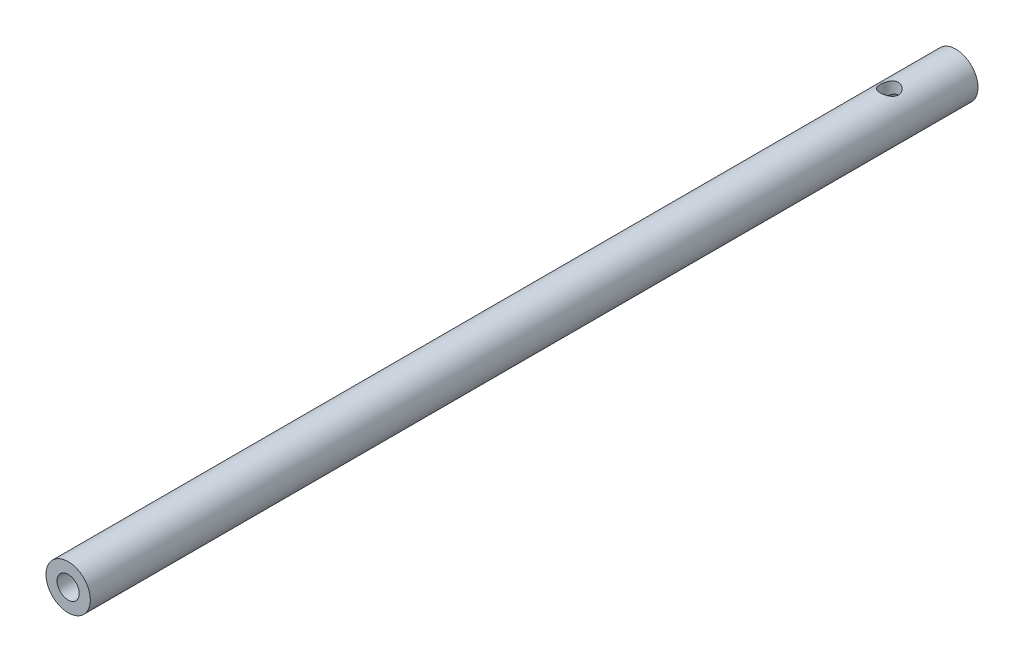
ISO-10303-21;
HEADER;
FILE_DESCRIPTION(('STEP AP214'),'2;1');
FILE_NAME('part.step','',(''),(''),'','','');
FILE_SCHEMA(('AUTOMOTIVE_DESIGN { 1 0 10303 214 1 1 1 1 }'));
ENDSEC;
DATA;
#1=APPLICATION_CONTEXT('core data for automotive mechanical design processes');
#2=APPLICATION_PROTOCOL_DEFINITION('international standard','automotive_design',2000,#1);
#3=PRODUCT_CONTEXT('',#1,'mechanical');
#4=PRODUCT('Part','Part','',(#3));
#5=PRODUCT_RELATED_PRODUCT_CATEGORY('part','',(#4));
#6=PRODUCT_DEFINITION_FORMATION('','',#4);
#7=PRODUCT_DEFINITION_CONTEXT('part definition',#1,'design');
#8=PRODUCT_DEFINITION('design','',#6,#7);
#9=PRODUCT_DEFINITION_SHAPE('','',#8);
#10=(LENGTH_UNIT() NAMED_UNIT(*) SI_UNIT(.MILLI.,.METRE.));
#11=(NAMED_UNIT(*) PLANE_ANGLE_UNIT() SI_UNIT($,.RADIAN.));
#12=(NAMED_UNIT(*) SI_UNIT($,.STERADIAN.) SOLID_ANGLE_UNIT());
#13=UNCERTAINTY_MEASURE_WITH_UNIT(LENGTH_MEASURE(1.E-05),#10,'distance_accuracy_value','');
#14=(GEOMETRIC_REPRESENTATION_CONTEXT(3) GLOBAL_UNCERTAINTY_ASSIGNED_CONTEXT((#13)) GLOBAL_UNIT_ASSIGNED_CONTEXT((#10,
#11,#12)) REPRESENTATION_CONTEXT('',''));
#15=CARTESIAN_POINT('',(0.,0.,0.));
#16=DIRECTION('',(0.,0.,1.));
#17=DIRECTION('',(1.,0.,0.));
#18=AXIS2_PLACEMENT_3D('',#15,#16,#17);
#19=CARTESIAN_POINT('',(0.,0.,254.));
#20=DIRECTION('',(0.,0.,-1.));
#21=DIRECTION('',(-1.,0.,0.));
#22=AXIS2_PLACEMENT_3D('',#19,#20,#21);
#23=CYLINDRICAL_SURFACE('',#22,6.35);
#24=CARTESIAN_POINT('',(0.,0.,254.));
#25=DIRECTION('',(0.,0.,1.));
#26=DIRECTION('',(1.,0.,0.));
#27=AXIS2_PLACEMENT_3D('',#24,#25,#26);
#28=CIRCLE('',#27,6.35);
#29=CARTESIAN_POINT('',(6.35,0.,254.));
#30=VERTEX_POINT('',#29);
#31=EDGE_CURVE('E10',#30,#30,#28,.T.);
#32=ORIENTED_EDGE('',*,*,#31,.F.);
#33=EDGE_LOOP('',(#32));
#34=FACE_BOUND('',#33,.T.);
#35=CARTESIAN_POINT('',(0.,0.,0.));
#36=DIRECTION('',(0.,0.,1.));
#37=DIRECTION('',(1.,0.,0.));
#38=AXIS2_PLACEMENT_3D('',#35,#36,#37);
#39=CIRCLE('',#38,6.35);
#40=CARTESIAN_POINT('',(6.35,0.,0.));
#41=VERTEX_POINT('',#40);
#42=EDGE_CURVE('E49',#41,#41,#39,.T.);
#43=ORIENTED_EDGE('',*,*,#42,.T.);
#44=EDGE_LOOP('',(#43));
#45=FACE_BOUND('',#44,.T.);
#46=CARTESIAN_POINT('',(0.,-6.35,16.4465));
#47=CARTESIAN_POINT('',(0.139658814291288,-6.34999230960377,16.4465102226711));
#48=CARTESIAN_POINT('',(0.279530257247805,-6.34534036381928,16.4578017537463));
#49=CARTESIAN_POINT('',(0.555326205995201,-6.32718958016325,16.5025616753636));
#50=CARTESIAN_POINT('',(0.691239232516735,-6.31366725988581,16.5360889328069));
#51=CARTESIAN_POINT('',(0.954668600487469,-6.27922707037871,16.6238871124743));
#52=CARTESIAN_POINT('',(1.08221135527028,-6.25833393780924,16.6780886998569));
#53=CARTESIAN_POINT('',(1.32627409088728,-6.21119684091545,16.8054140515908));
#54=CARTESIAN_POINT('',(1.44279759021604,-6.18495459308891,16.8785317479016));
#55=CARTESIAN_POINT('',(1.66739734947652,-6.12831928174332,17.0453966831688));
#56=CARTESIAN_POINT('',(1.77486323558414,-6.09779311517474,17.1399199354052));
#57=CARTESIAN_POINT('',(1.97293884172907,-6.0366199159849,17.3452732090919));
#58=CARTESIAN_POINT('',(2.06353994471538,-6.00597282970173,17.4561115151993));
#59=CARTESIAN_POINT('',(2.22954167018138,-5.94641053890916,17.69730674714));
#60=CARTESIAN_POINT('',(2.30402094366906,-5.91764575362854,17.8283387990433));
#61=CARTESIAN_POINT('',(2.42960950289775,-5.86720650548979,18.1024235877533));
#62=CARTESIAN_POINT('',(2.48073044904994,-5.84552850646919,18.24547028457));
#63=CARTESIAN_POINT('',(2.55565156257861,-5.81315316290526,18.5325021377006));
#64=CARTESIAN_POINT('',(2.58062408509252,-5.80198713580705,18.676126426089));
#65=CARTESIAN_POINT('',(2.60619906398776,-5.79054777240608,18.9659274568753));
#66=CARTESIAN_POINT('',(2.60681435812765,-5.79026869801029,19.112102814056));
#67=CARTESIAN_POINT('',(2.58454261015411,-5.80023683264105,19.3913489386495));
#68=CARTESIAN_POINT('',(2.56338615410154,-5.80970896160431,19.5245908830448));
#69=CARTESIAN_POINT('',(2.5010673028753,-5.83680602043765,19.7854339864594));
#70=CARTESIAN_POINT('',(2.45990121708404,-5.85443245427567,19.9130341001494));
#71=CARTESIAN_POINT('',(2.35793588852338,-5.89624608381517,20.1621374857699));
#72=CARTESIAN_POINT('',(2.29674349739842,-5.92056295920541,20.2834570877194));
#73=CARTESIAN_POINT('',(2.15673971446528,-5.97298517723353,20.5145674290705));
#74=CARTESIAN_POINT('',(2.07792150298237,-6.001091984573,20.6243536818286));
#75=CARTESIAN_POINT('',(1.89735106245734,-6.06071802706638,20.8387069358899));
#76=CARTESIAN_POINT('',(1.79425242543104,-6.09232858785375,20.9421174690434));
#77=CARTESIAN_POINT('',(1.57185331692354,-6.15345975457155,21.1305618702178));
#78=CARTESIAN_POINT('',(1.45254929499361,-6.18297990034933,21.2155917005894));
#79=CARTESIAN_POINT('',(1.19770658302539,-6.23741262563076,21.3664839632734));
#80=CARTESIAN_POINT('',(1.06187172814138,-6.2622112927114,21.4318903166335));
#81=CARTESIAN_POINT('',(0.779851265954162,-6.30353804709347,21.5385209026196));
#82=CARTESIAN_POINT('',(0.633671239074538,-6.32007055511376,21.5797580628994));
#83=CARTESIAN_POINT('',(0.344786356341334,-6.34218454804494,21.6344922632422));
#84=CARTESIAN_POINT('',(0.202422473732529,-6.34837809999038,21.6495421709774));
#85=CARTESIAN_POINT('',(-0.0829187905619075,-6.35105963877295,21.6560863095486));
#86=CARTESIAN_POINT('',(-0.225895992291909,-6.34755030086248,21.6475870332953));
#87=CARTESIAN_POINT('',(-0.50122811648109,-6.33161894915713,21.6083982329454));
#88=CARTESIAN_POINT('',(-0.633764366126784,-6.31963018013048,21.5787868338127));
#89=CARTESIAN_POINT('',(-0.891852024786359,-6.28840276052691,21.4997012529322));
#90=CARTESIAN_POINT('',(-1.01740254253342,-6.26916318728721,21.4502245432767));
#91=CARTESIAN_POINT('',(-1.26232894087162,-6.22454880909407,21.3311952083711));
#92=CARTESIAN_POINT('',(-1.38139405487112,-6.19900276246011,21.2610693641021));
#93=CARTESIAN_POINT('',(-1.60649026009733,-6.1445197225746,21.1033645178561));
#94=CARTESIAN_POINT('',(-1.71251596155739,-6.11558133670772,21.0157783376928));
#95=CARTESIAN_POINT('',(-1.91623851491026,-6.05496475787895,20.8185327714779));
#96=CARTESIAN_POINT('',(-2.01284942796907,-6.02323564843281,20.7077645329559));
#97=CARTESIAN_POINT('',(-2.18640018463071,-5.96243507573864,20.4710585688108));
#98=CARTESIAN_POINT('',(-2.26333607582038,-5.93336414723113,20.3451178027206));
#99=CARTESIAN_POINT('',(-2.39603879254114,-5.88104346392423,20.0793343439105));
#100=CARTESIAN_POINT('',(-2.45153279874427,-5.85786993450669,19.9393393363992));
#101=CARTESIAN_POINT('',(-2.53770460075326,-5.82106452476415,19.6507476518406));
#102=CARTESIAN_POINT('',(-2.56840198459768,-5.80742511413165,19.5021578638576));
#103=CARTESIAN_POINT('',(-2.60219242273593,-5.79235748837676,19.2126021576906));
#104=CARTESIAN_POINT('',(-2.60718297249355,-5.79009022443092,19.0719001670726));
#105=CARTESIAN_POINT('',(-2.59445040708602,-5.79580681396036,18.7917543511859));
#106=CARTESIAN_POINT('',(-2.57673052204656,-5.80378920961758,18.6523103498327));
#107=CARTESIAN_POINT('',(-2.52065654106205,-5.82834944297404,18.3848964057967));
#108=CARTESIAN_POINT('',(-2.48323688739072,-5.84453688190049,18.2566913061476));
#109=CARTESIAN_POINT('',(-2.38972322864851,-5.88338960597767,18.0083403796797));
#110=CARTESIAN_POINT('',(-2.33362401134901,-5.90605669892048,17.888196813556));
#111=CARTESIAN_POINT('',(-2.20052479575199,-5.9569745038205,17.6516460948968));
#112=CARTESIAN_POINT('',(-2.1224866851117,-5.98547579558712,17.5358779211985));
#113=CARTESIAN_POINT('',(-1.94920724720872,-6.04412554936823,17.3184853875796));
#114=CARTESIAN_POINT('',(-1.85396026421548,-6.0742745506268,17.2168656970856));
#115=CARTESIAN_POINT('',(-1.6410798278914,-6.13534240451432,17.0233888658623));
#116=CARTESIAN_POINT('',(-1.52235000699563,-6.16616891944458,16.9327025728417));
#117=CARTESIAN_POINT('',(-1.27024233738986,-6.22299683169476,16.7724962926239));
#118=CARTESIAN_POINT('',(-1.13685780867586,-6.24899601394218,16.702986012936));
#119=CARTESIAN_POINT('',(-0.861278105300862,-6.29283247760503,16.5886555473835));
#120=CARTESIAN_POINT('',(-0.719277343203342,-6.31080429477782,16.543425601333));
#121=CARTESIAN_POINT('',(-0.501791524831137,-6.33056448241423,16.4942301616195));
#122=CARTESIAN_POINT('',(-0.428615766398928,-6.33595002408025,16.4809434755522));
#123=CARTESIAN_POINT('',(-0.281267751907738,-6.34419451089781,16.4606735980613));
#124=CARTESIAN_POINT('',(-0.207096209063075,-6.3470551756885,16.4536861163161));
#125=CARTESIAN_POINT('',(-0.0885557035358978,-6.34953782883293,16.4476280191557));
#126=CARTESIAN_POINT('',(-0.0442885432499056,-6.35000243877515,16.4464967581909));
#127=CARTESIAN_POINT('',(0.,-6.35,16.4465));
#128=B_SPLINE_CURVE_WITH_KNOTS('',3,(#46,#47,#48,#49,#50,#51,#52,#53,#54,#55,#56,#57,#58,#59,
#60,#61,#62,#63,#64,#65,#66,#67,#68,#69,#70,#71,#72,#73,#74,#75,#76,#77,#78,#79,#80,#81,#82,#83,
#84,#85,#86,#87,#88,#89,#90,#91,#92,#93,#94,#95,#96,#97,#98,#99,#100,#101,#102,#103,#104,#105,
#106,#107,#108,#109,#110,#111,#112,#113,#114,#115,#116,#117,#118,#119,#120,#121,#122,#123,#124,
#125,#126,#127),.UNSPECIFIED.,.T.,.F.,(4,2,2,2,2,2,2,2,2,2,2,2,2,2,2,2,2,2,2,2,2,2,2,2,2,2,2,2,
2,2,2,2,2,2,2,2,2,2,2,2,4),(0.,0.418824952152904,0.838763152069475,1.25730522789203,
1.67571320700917,2.11282308644708,2.55015569751733,3.00816798353866,3.46595138065273,
3.90219446105925,4.33820761144848,4.7420529586814,5.14597282026785,5.55835258391516,
5.97089217993274,6.41708714075756,6.86338001689069,7.31935953204488,7.77509492909297,
8.20274590023983,8.63027897247198,9.03741292116043,9.44459869503167,9.86436923899497,
10.2843127136758,10.7333502850375,11.1824779904963,11.6371455486626,12.0914535909639,
12.5116916207472,12.9318698863277,13.3337074298688,13.7356571937388,14.1613289641154,
14.5871408876974,15.0425735066561,15.4982145919813,15.9459030191694,16.169350764064,
16.3926462058248,16.5254637949021),.UNSPECIFIED.);
#129=CARTESIAN_POINT('',(0.,-6.35,16.4465));
#130=VERTEX_POINT('',#129);
#131=EDGE_CURVE('E77',#130,#130,#128,.T.);
#132=ORIENTED_EDGE('',*,*,#131,.F.);
#133=EDGE_LOOP('',(#132));
#134=FACE_BOUND('',#133,.T.);
#135=CARTESIAN_POINT('',(0.,6.35,16.4465));
#136=CARTESIAN_POINT('',(-0.139658814291288,6.34999230960377,16.4465102226711));
#137=CARTESIAN_POINT('',(-0.279530257247805,6.34534036381928,16.4578017537463));
#138=CARTESIAN_POINT('',(-0.555326205995201,6.32718958016325,16.5025616753636));
#139=CARTESIAN_POINT('',(-0.691239232516735,6.31366725988581,16.5360889328069));
#140=CARTESIAN_POINT('',(-0.954668600487469,6.27922707037871,16.6238871124743));
#141=CARTESIAN_POINT('',(-1.08221135527028,6.25833393780924,16.6780886998569));
#142=CARTESIAN_POINT('',(-1.32627409088728,6.21119684091545,16.8054140515908));
#143=CARTESIAN_POINT('',(-1.44279759021604,6.18495459308891,16.8785317479016));
#144=CARTESIAN_POINT('',(-1.66739734947652,6.12831928174332,17.0453966831688));
#145=CARTESIAN_POINT('',(-1.77486323558414,6.09779311517474,17.1399199354052));
#146=CARTESIAN_POINT('',(-1.97293884172907,6.0366199159849,17.3452732090919));
#147=CARTESIAN_POINT('',(-2.06353994471538,6.00597282970173,17.4561115151993));
#148=CARTESIAN_POINT('',(-2.22954167018138,5.94641053890916,17.69730674714));
#149=CARTESIAN_POINT('',(-2.30402094366906,5.91764575362854,17.8283387990433));
#150=CARTESIAN_POINT('',(-2.42960950289775,5.86720650548979,18.1024235877533));
#151=CARTESIAN_POINT('',(-2.48073044904994,5.84552850646919,18.24547028457));
#152=CARTESIAN_POINT('',(-2.55565156257861,5.81315316290526,18.5325021377006));
#153=CARTESIAN_POINT('',(-2.58062408509252,5.80198713580705,18.676126426089));
#154=CARTESIAN_POINT('',(-2.60619906398776,5.79054777240608,18.9659274568753));
#155=CARTESIAN_POINT('',(-2.60681435812765,5.79026869801029,19.112102814056));
#156=CARTESIAN_POINT('',(-2.58454261015411,5.80023683264105,19.3913489386495));
#157=CARTESIAN_POINT('',(-2.56338615410154,5.80970896160431,19.5245908830448));
#158=CARTESIAN_POINT('',(-2.5010673028753,5.83680602043765,19.7854339864594));
#159=CARTESIAN_POINT('',(-2.45990121708404,5.85443245427567,19.9130341001494));
#160=CARTESIAN_POINT('',(-2.35793588852338,5.89624608381517,20.1621374857699));
#161=CARTESIAN_POINT('',(-2.29674349739842,5.92056295920541,20.2834570877194));
#162=CARTESIAN_POINT('',(-2.15673971446528,5.97298517723353,20.5145674290705));
#163=CARTESIAN_POINT('',(-2.07792150298237,6.001091984573,20.6243536818286));
#164=CARTESIAN_POINT('',(-1.89735106245734,6.06071802706638,20.8387069358899));
#165=CARTESIAN_POINT('',(-1.79425242543104,6.09232858785375,20.9421174690434));
#166=CARTESIAN_POINT('',(-1.57185331692354,6.15345975457155,21.1305618702178));
#167=CARTESIAN_POINT('',(-1.45254929499361,6.18297990034933,21.2155917005894));
#168=CARTESIAN_POINT('',(-1.19770658302539,6.23741262563076,21.3664839632734));
#169=CARTESIAN_POINT('',(-1.06187172814138,6.2622112927114,21.4318903166335));
#170=CARTESIAN_POINT('',(-0.779851265954162,6.30353804709347,21.5385209026196));
#171=CARTESIAN_POINT('',(-0.633671239074538,6.32007055511376,21.5797580628994));
#172=CARTESIAN_POINT('',(-0.344786356341334,6.34218454804494,21.6344922632422));
#173=CARTESIAN_POINT('',(-0.202422473732529,6.34837809999038,21.6495421709774));
#174=CARTESIAN_POINT('',(0.0829187905619075,6.35105963877295,21.6560863095486));
#175=CARTESIAN_POINT('',(0.225895992291909,6.34755030086248,21.6475870332953));
#176=CARTESIAN_POINT('',(0.50122811648109,6.33161894915713,21.6083982329454));
#177=CARTESIAN_POINT('',(0.633764366126784,6.31963018013048,21.5787868338127));
#178=CARTESIAN_POINT('',(0.891852024786359,6.28840276052691,21.4997012529322));
#179=CARTESIAN_POINT('',(1.01740254253342,6.26916318728721,21.4502245432767));
#180=CARTESIAN_POINT('',(1.26232894087162,6.22454880909407,21.3311952083711));
#181=CARTESIAN_POINT('',(1.38139405487112,6.19900276246011,21.2610693641021));
#182=CARTESIAN_POINT('',(1.60649026009733,6.1445197225746,21.1033645178561));
#183=CARTESIAN_POINT('',(1.71251596155739,6.11558133670772,21.0157783376928));
#184=CARTESIAN_POINT('',(1.91623851491026,6.05496475787895,20.8185327714779));
#185=CARTESIAN_POINT('',(2.01284942796907,6.02323564843281,20.7077645329559));
#186=CARTESIAN_POINT('',(2.18640018463071,5.96243507573864,20.4710585688108));
#187=CARTESIAN_POINT('',(2.26333607582038,5.93336414723113,20.3451178027206));
#188=CARTESIAN_POINT('',(2.39603879254114,5.88104346392423,20.0793343439105));
#189=CARTESIAN_POINT('',(2.45153279874427,5.85786993450669,19.9393393363992));
#190=CARTESIAN_POINT('',(2.53770460075326,5.82106452476415,19.6507476518406));
#191=CARTESIAN_POINT('',(2.56840198459768,5.80742511413165,19.5021578638576));
#192=CARTESIAN_POINT('',(2.60219242273593,5.79235748837676,19.2126021576906));
#193=CARTESIAN_POINT('',(2.60718297249355,5.79009022443092,19.0719001670726));
#194=CARTESIAN_POINT('',(2.59445040708602,5.79580681396036,18.7917543511859));
#195=CARTESIAN_POINT('',(2.57673052204656,5.80378920961758,18.6523103498327));
#196=CARTESIAN_POINT('',(2.52065654106205,5.82834944297404,18.3848964057967));
#197=CARTESIAN_POINT('',(2.48323688739072,5.84453688190049,18.2566913061476));
#198=CARTESIAN_POINT('',(2.38972322864851,5.88338960597767,18.0083403796797));
#199=CARTESIAN_POINT('',(2.33362401134901,5.90605669892048,17.888196813556));
#200=CARTESIAN_POINT('',(2.20052479575199,5.9569745038205,17.6516460948968));
#201=CARTESIAN_POINT('',(2.1224866851117,5.98547579558712,17.5358779211985));
#202=CARTESIAN_POINT('',(1.94920724720872,6.04412554936823,17.3184853875796));
#203=CARTESIAN_POINT('',(1.85396026421548,6.0742745506268,17.2168656970856));
#204=CARTESIAN_POINT('',(1.6410798278914,6.13534240451432,17.0233888658623));
#205=CARTESIAN_POINT('',(1.52235000699563,6.16616891944458,16.9327025728417));
#206=CARTESIAN_POINT('',(1.27024233738986,6.22299683169476,16.7724962926239));
#207=CARTESIAN_POINT('',(1.13685780867586,6.24899601394218,16.702986012936));
#208=CARTESIAN_POINT('',(0.861278105300862,6.29283247760503,16.5886555473835));
#209=CARTESIAN_POINT('',(0.719277343203342,6.31080429477782,16.543425601333));
#210=CARTESIAN_POINT('',(0.501791524831137,6.33056448241423,16.4942301616195));
#211=CARTESIAN_POINT('',(0.428615766398928,6.33595002408025,16.4809434755522));
#212=CARTESIAN_POINT('',(0.281267751907738,6.34419451089781,16.4606735980613));
#213=CARTESIAN_POINT('',(0.207096209063075,6.3470551756885,16.4536861163161));
#214=CARTESIAN_POINT('',(0.0885557035358978,6.34953782883293,16.4476280191557));
#215=CARTESIAN_POINT('',(0.0442885432499056,6.35000243877515,16.4464967581909));
#216=CARTESIAN_POINT('',(0.,6.35,16.4465));
#217=B_SPLINE_CURVE_WITH_KNOTS('',3,(#135,#136,#137,#138,#139,#140,#141,#142,#143,#144,#145,
#146,#147,#148,#149,#150,#151,#152,#153,#154,#155,#156,#157,#158,#159,#160,#161,#162,#163,#164,
#165,#166,#167,#168,#169,#170,#171,#172,#173,#174,#175,#176,#177,#178,#179,#180,#181,#182,#183,
#184,#185,#186,#187,#188,#189,#190,#191,#192,#193,#194,#195,#196,#197,#198,#199,#200,#201,#202,
#203,#204,#205,#206,#207,#208,#209,#210,#211,#212,#213,#214,#215,#216),.UNSPECIFIED.,.T.,.F.,(4,
2,2,2,2,2,2,2,2,2,2,2,2,2,2,2,2,2,2,2,2,2,2,2,2,2,2,2,2,2,2,2,2,2,2,2,2,2,2,2,4),(0.,
0.418824952152904,0.838763152069475,1.25730522789203,1.67571320700917,2.11282308644708,
2.55015569751733,3.00816798353866,3.46595138065273,3.90219446105925,4.33820761144848,
4.7420529586814,5.14597282026785,5.55835258391516,5.97089217993274,6.41708714075756,
6.86338001689069,7.31935953204488,7.77509492909297,8.20274590023983,8.63027897247198,
9.03741292116043,9.44459869503167,9.86436923899497,10.2843127136758,10.7333502850375,
11.1824779904963,11.6371455486626,12.0914535909639,12.5116916207472,12.9318698863277,
13.3337074298688,13.7356571937388,14.1613289641154,14.5871408876974,15.0425735066561,
15.4982145919813,15.9459030191694,16.169350764064,16.3926462058248,16.5254637949021),.UNSPECIFIED.);
#218=CARTESIAN_POINT('',(0.,6.35,16.4465));
#219=VERTEX_POINT('',#218);
#220=EDGE_CURVE('E82',#219,#219,#217,.T.);
#221=ORIENTED_EDGE('',*,*,#220,.F.);
#222=EDGE_LOOP('',(#221));
#223=FACE_BOUND('',#222,.T.);
#224=ADVANCED_FACE('F36',(#34,#45,#134,#223),#23,.T.);
#225=CARTESIAN_POINT('',(0.,0.,254.));
#226=DIRECTION('',(0.,0.,-1.));
#227=DIRECTION('',(-1.,0.,0.));
#228=AXIS2_PLACEMENT_3D('',#225,#226,#227);
#229=CYLINDRICAL_SURFACE('',#228,3.175);
#230=CARTESIAN_POINT('',(0.,-3.175,16.4465));
#231=CARTESIAN_POINT('',(0.124123475975315,-3.17498963844609,16.4465106418092));
#232=CARTESIAN_POINT('',(0.248399817811965,-3.16764822022756,16.4554500467395));
#233=CARTESIAN_POINT('',(0.492915685238948,-3.13893180286522,16.4905902554952));
#234=CARTESIAN_POINT('',(0.613147071737956,-3.11753010274403,16.516823902031));
#235=CARTESIAN_POINT('',(0.845370064526018,-3.06269871701765,16.5846185779613));
#236=CARTESIAN_POINT('',(0.95740883594244,-3.02934570561062,16.6260819419339));
#237=CARTESIAN_POINT('',(1.1719899729014,-2.95297497446787,16.7222331235048));
#238=CARTESIAN_POINT('',(1.27453147910821,-2.90995638137086,16.7769221361784));
#239=CARTESIAN_POINT('',(1.50418874828167,-2.79992252111318,16.9192990661828));
#240=CARTESIAN_POINT('',(1.62685974340384,-2.72984396144292,17.0117786184528));
#241=CARTESIAN_POINT('',(1.85222572926917,-2.58226149625843,17.2141003448508));
#242=CARTESIAN_POINT('',(1.95486191966328,-2.50473670147969,17.3239919612765));
#243=CARTESIAN_POINT('',(2.09419892563397,-2.38720547545904,17.5013513223961));
#244=CARTESIAN_POINT('',(2.13853064808069,-2.34746698005741,17.5631569207765));
#245=CARTESIAN_POINT('',(2.22185003224185,-2.26876311834293,17.6908056012042));
#246=CARTESIAN_POINT('',(2.26083592730141,-2.2297980112354,17.7566500076163));
#247=CARTESIAN_POINT('',(2.33318274771518,-2.15397803623534,17.8922601426137));
#248=CARTESIAN_POINT('',(2.36655779505138,-2.11711802939653,17.9620154187102));
#249=CARTESIAN_POINT('',(2.42746797872266,-2.04699254721169,18.1057036245187));
#250=CARTESIAN_POINT('',(2.4550081415199,-2.01372399022972,18.1796328884336));
#251=CARTESIAN_POINT('',(2.50658873716791,-1.94923911746055,18.34065517433));
#252=CARTESIAN_POINT('',(2.52985620476328,-1.91870498324858,18.4282818370175));
#253=CARTESIAN_POINT('',(2.56739303486915,-1.86818689698901,18.6082806500316));
#254=CARTESIAN_POINT('',(2.58168481380992,-1.84817668237134,18.7006403501036));
#255=CARTESIAN_POINT('',(2.60028691219318,-1.82192817278465,18.8894397334531));
#256=CARTESIAN_POINT('',(2.60448888485103,-1.81583940257808,18.9859124796543));
#257=CARTESIAN_POINT('',(2.60211315740838,-1.81923902416289,19.178462849654));
#258=CARTESIAN_POINT('',(2.59553081649723,-1.82873412215904,19.2745402855004));
#259=CARTESIAN_POINT('',(2.57094397805907,-1.86315400856162,19.4739309975834));
#260=CARTESIAN_POINT('',(2.55170022727413,-1.88974469136245,19.5767864608502));
#261=CARTESIAN_POINT('',(2.50232253625902,-1.95464781624411,19.7760915351039));
#262=CARTESIAN_POINT('',(2.47215411497205,-1.99299731274799,19.8725197059534));
#263=CARTESIAN_POINT('',(2.41011212928528,-2.06731302203853,20.0376797886949));
#264=CARTESIAN_POINT('',(2.38013051431427,-2.10189249500399,20.1077810814778));
#265=CARTESIAN_POINT('',(2.3147744528378,-2.17366213153367,20.2440440338509));
#266=CARTESIAN_POINT('',(2.27939711926159,-2.21085368695475,20.3102035578185));
#267=CARTESIAN_POINT('',(2.16543772342222,-2.32442703413847,20.5030818847659));
#268=CARTESIAN_POINT('',(2.07905422537913,-2.40277435290891,20.6241328491213));
#269=CARTESIAN_POINT('',(1.88227893075194,-2.56012511257142,20.855323319086));
#270=CARTESIAN_POINT('',(1.77105880109227,-2.63902738873259,20.9648251687795));
#271=CARTESIAN_POINT('',(1.52707791149912,-2.78727841350137,21.1644605990421));
#272=CARTESIAN_POINT('',(1.39437058393799,-2.85665009058512,21.2546409662546));
#273=CARTESIAN_POINT('',(1.14717455706696,-2.96269415784093,21.3901696285999));
#274=CARTESIAN_POINT('',(1.03734481071855,-3.00314655826614,21.4410551408327));
#275=CARTESIAN_POINT('',(0.808472770456212,-3.07266264818783,21.5278057635169));
#276=CARTESIAN_POINT('',(0.68943703960591,-3.10173436310675,21.5636814598098));
#277=CARTESIAN_POINT('',(0.444137934137715,-3.14626597447226,21.6184300343538));
#278=CARTESIAN_POINT('',(0.317832509624815,-3.16163592073425,21.637190572499));
#279=CARTESIAN_POINT('',(0.0629120037225398,-3.17693912736037,21.6558704359244));
#280=CARTESIAN_POINT('',(-0.0657020679859935,-3.17687897911894,21.6557978063164));
#281=CARTESIAN_POINT('',(-0.307380967024323,-3.16216462368221,21.637835240569));
#282=CARTESIAN_POINT('',(-0.420683678390806,-3.14901320282353,21.6217799880322));
#283=CARTESIAN_POINT('',(-0.642383248668984,-3.11136927044028,21.5755465378232));
#284=CARTESIAN_POINT('',(-0.750779218579701,-3.08687471272838,21.5453657920442));
#285=CARTESIAN_POINT('',(-0.964119386725454,-3.02717779548716,21.4711357905476));
#286=CARTESIAN_POINT('',(-1.06880671667245,-2.99162801371886,21.4266346376171));
#287=CARTESIAN_POINT('',(-1.26901924959804,-2.91235960230411,21.3260440279604));
#288=CARTESIAN_POINT('',(-1.36454176445306,-2.86863858697832,21.2699511864096));
#289=CARTESIAN_POINT('',(-1.58678190557675,-2.75401917991627,21.1201514119405));
#290=CARTESIAN_POINT('',(-1.7080886149019,-2.67976797972567,21.0209018277562));
#291=CARTESIAN_POINT('',(-1.87403957004747,-2.56382769666463,20.8589248884873));
#292=CARTESIAN_POINT('',(-1.9267970716164,-2.52431861471154,20.8025956564661));
#293=CARTESIAN_POINT('',(-2.02691784622181,-2.44464891997432,20.6857649138503));
#294=CARTESIAN_POINT('',(-2.07428337510764,-2.40448858774877,20.6252651652179));
#295=CARTESIAN_POINT('',(-2.16433735799768,-2.32378756743909,20.4991265339281));
#296=CARTESIAN_POINT('',(-2.20693199095684,-2.28325211743441,20.4334174662671));
#297=CARTESIAN_POINT('',(-2.28640153755373,-2.2036681857531,20.2977045006104));
#298=CARTESIAN_POINT('',(-2.32327376010172,-2.16462041016166,20.227698603401));
#299=CARTESIAN_POINT('',(-2.39086352498481,-2.08971969393378,20.0835812934822));
#300=CARTESIAN_POINT('',(-2.4216077188949,-2.0538533127457,20.0094895312605));
#301=CARTESIAN_POINT('',(-2.47664506007239,-1.98713910557181,19.8568537906105));
#302=CARTESIAN_POINT('',(-2.50094648664364,-1.9562848586747,19.7783156851154));
#303=CARTESIAN_POINT('',(-2.54327599370942,-1.90095794348242,19.6134580581764));
#304=CARTESIAN_POINT('',(-2.56100550798422,-1.87679933394889,19.5269514390612));
#305=CARTESIAN_POINT('',(-2.5876534922232,-1.83989414331906,19.3503256458426));
#306=CARTESIAN_POINT('',(-2.59659432871273,-1.82711860097366,19.2602162526084));
#307=CARTESIAN_POINT('',(-2.60495254879583,-1.81518976727652,19.0780256298436));
#308=CARTESIAN_POINT('',(-2.60430968129299,-1.81612265795785,18.9859355630085));
#309=CARTESIAN_POINT('',(-2.59341679087731,-1.83163548536389,18.8034382810022));
#310=CARTESIAN_POINT('',(-2.58315195253364,-1.84623646748739,18.7130338803149));
#311=CARTESIAN_POINT('',(-2.54997673926941,-1.8918812502243,18.5126542661853));
#312=CARTESIAN_POINT('',(-2.52441782222473,-1.92627916500783,18.4039143677315));
#313=CARTESIAN_POINT('',(-2.46129495688758,-2.00629861106377,18.194247588425));
#314=CARTESIAN_POINT('',(-2.42369344788068,-2.051955153997,18.0933463964546));
#315=CARTESIAN_POINT('',(-2.3481130092383,-2.13762622484276,17.9225798914479));
#316=CARTESIAN_POINT('',(-2.31236943659221,-2.17638361196671,17.8510580683787));
#317=CARTESIAN_POINT('',(-2.23498804969185,-2.25577612111845,17.7123322061681));
#318=CARTESIAN_POINT('',(-2.19334745554498,-2.29641212261643,17.6451302252752));
#319=CARTESIAN_POINT('',(-2.10429577317293,-2.37828173675713,17.5149528245459));
#320=CARTESIAN_POINT('',(-2.05688038011104,-2.41951577478702,17.4519806127263));
#321=CARTESIAN_POINT('',(-1.95637146026668,-2.50149120394898,17.3303909156084));
#322=CARTESIAN_POINT('',(-1.9032749976447,-2.54223232813257,17.2717757086789));
#323=CARTESIAN_POINT('',(-1.73319854916756,-2.66387797753868,17.1005332294575));
#324=CARTESIAN_POINT('',(-1.60709272871661,-2.74259807229652,16.9949621509566));
#325=CARTESIAN_POINT('',(-1.40107169928099,-2.85020133536392,16.8540678587196));
#326=CARTESIAN_POINT('',(-1.32964369896844,-2.88430266583608,16.8100382853854));
#327=CARTESIAN_POINT('',(-1.18137409748018,-2.94813161513573,16.7284226506034));
#328=CARTESIAN_POINT('',(-1.10453586658905,-2.97786192184529,16.6908326269014));
#329=CARTESIAN_POINT('',(-0.918815482353876,-3.04122104053273,16.6112763557519));
#330=CARTESIAN_POINT('',(-0.807938741999689,-3.07272413283515,16.5721862774387));
#331=CARTESIAN_POINT('',(-0.579524537035622,-3.12384313970281,16.5090693635151));
#332=CARTESIAN_POINT('',(-0.462004057715223,-3.14348799034806,16.4850058555805));
#333=CARTESIAN_POINT('',(-0.286186339215559,-3.16259123109924,16.461644233628));
#334=CARTESIAN_POINT('',(-0.229212891132979,-3.16723273070072,16.4559769862016));
#335=CARTESIAN_POINT('',(-0.11483727622137,-3.17343990585332,16.4484019264044));
#336=CARTESIAN_POINT('',(-0.0574350034855349,-3.17500479454737,16.4464950757716));
#337=CARTESIAN_POINT('',(0.,-3.175,16.4465));
#338=B_SPLINE_CURVE_WITH_KNOTS('',3,(#230,#231,#232,#233,#234,#235,#236,#237,#238,#239,#240,
#241,#242,#243,#244,#245,#246,#247,#248,#249,#250,#251,#252,#253,#254,#255,#256,#257,#258,#259,
#260,#261,#262,#263,#264,#265,#266,#267,#268,#269,#270,#271,#272,#273,#274,#275,#276,#277,#278,
#279,#280,#281,#282,#283,#284,#285,#286,#287,#288,#289,#290,#291,#292,#293,#294,#295,#296,#297,
#298,#299,#300,#301,#302,#303,#304,#305,#306,#307,#308,#309,#310,#311,#312,#313,#314,#315,#316,
#317,#318,#319,#320,#321,#322,#323,#324,#325,#326,#327,#328,#329,#330,#331,#332,#333,#334,#335,
#336,#337),.UNSPECIFIED.,.T.,.F.,(4,2,2,2,2,2,2,2,2,2,2,2,2,2,2,2,2,2,2,2,2,2,2,2,2,2,2,2,2,2,2,
2,2,2,2,2,2,2,2,2,2,2,2,2,2,2,2,2,2,2,2,2,2,4),(0.,0.372121110694421,0.744950943333154,
1.11543047898384,1.48594350384491,1.98985717146685,2.49522824914306,2.75246608989209,
3.00978873712746,3.2664537027931,3.5228966572058,3.8089939639097,4.09437388234913,
4.38280483874359,4.6713599481555,4.9934707245097,5.31660715494333,5.56744032301251,
5.81840817754302,6.32058007927763,6.84302172556953,7.36418362095608,7.7455759334797,
8.12669880951133,8.51030566083468,8.89374864408522,9.23772429777364,9.58176202538151,
9.93794272365023,10.2942275756089,10.811523950299,11.0714401134857,11.331247132299,
11.5954965586165,11.8598698799377,12.1230670389827,12.3859243178262,12.6595749069379,
12.9325272587596,13.2071963347532,13.4822890284081,13.8309834168996,14.1807761477987,
14.4470195601506,14.7133889016922,14.9799580383926,15.2466656030871,15.7900820157552,
16.0614094448483,16.3325693218519,16.696162261493,17.0588643491009,17.2310099730123,
17.4031996182171),.UNSPECIFIED.);
#339=CARTESIAN_POINT('',(0.,-3.175,16.4465));
#340=VERTEX_POINT('',#339);
#341=EDGE_CURVE('E59',#340,#340,#338,.T.);
#342=ORIENTED_EDGE('',*,*,#341,.T.);
#343=EDGE_LOOP('',(#342));
#344=FACE_BOUND('',#343,.T.);
#345=CARTESIAN_POINT('',(0.,0.,254.));
#346=DIRECTION('',(0.,0.,1.));
#347=DIRECTION('',(1.,0.,0.));
#348=AXIS2_PLACEMENT_3D('',#345,#346,#347);
#349=CIRCLE('',#348,3.175);
#350=CARTESIAN_POINT('',(3.175,0.,254.));
#351=VERTEX_POINT('',#350);
#352=EDGE_CURVE('E54',#351,#351,#349,.T.);
#353=ORIENTED_EDGE('',*,*,#352,.T.);
#354=EDGE_LOOP('',(#353));
#355=FACE_BOUND('',#354,.T.);
#356=CARTESIAN_POINT('',(0.,0.,0.));
#357=DIRECTION('',(0.,0.,1.));
#358=DIRECTION('',(1.,0.,0.));
#359=AXIS2_PLACEMENT_3D('',#356,#357,#358);
#360=CIRCLE('',#359,3.175);
#361=CARTESIAN_POINT('',(3.175,0.,0.));
#362=VERTEX_POINT('',#361);
#363=EDGE_CURVE('E57',#362,#362,#360,.T.);
#364=ORIENTED_EDGE('',*,*,#363,.F.);
#365=EDGE_LOOP('',(#364));
#366=FACE_BOUND('',#365,.T.);
#367=CARTESIAN_POINT('',(0.,3.175,16.4465));
#368=CARTESIAN_POINT('',(-0.124123475975315,3.17498963844609,16.4465106418092));
#369=CARTESIAN_POINT('',(-0.248399817811965,3.16764822022756,16.4554500467395));
#370=CARTESIAN_POINT('',(-0.492915685238948,3.13893180286522,16.4905902554952));
#371=CARTESIAN_POINT('',(-0.613147071737956,3.11753010274403,16.516823902031));
#372=CARTESIAN_POINT('',(-0.845370064526018,3.06269871701765,16.5846185779613));
#373=CARTESIAN_POINT('',(-0.95740883594244,3.02934570561062,16.6260819419339));
#374=CARTESIAN_POINT('',(-1.1719899729014,2.95297497446787,16.7222331235048));
#375=CARTESIAN_POINT('',(-1.27453147910821,2.90995638137086,16.7769221361784));
#376=CARTESIAN_POINT('',(-1.50418874828167,2.79992252111318,16.9192990661828));
#377=CARTESIAN_POINT('',(-1.62685974340384,2.72984396144292,17.0117786184528));
#378=CARTESIAN_POINT('',(-1.85222572926917,2.58226149625843,17.2141003448508));
#379=CARTESIAN_POINT('',(-1.95486191966328,2.50473670147969,17.3239919612765));
#380=CARTESIAN_POINT('',(-2.09419892563397,2.38720547545904,17.5013513223961));
#381=CARTESIAN_POINT('',(-2.13853064808069,2.34746698005741,17.5631569207765));
#382=CARTESIAN_POINT('',(-2.22185003224185,2.26876311834293,17.6908056012042));
#383=CARTESIAN_POINT('',(-2.26083592730141,2.2297980112354,17.7566500076163));
#384=CARTESIAN_POINT('',(-2.33318274771518,2.15397803623534,17.8922601426137));
#385=CARTESIAN_POINT('',(-2.36655779505138,2.11711802939653,17.9620154187102));
#386=CARTESIAN_POINT('',(-2.42746797872266,2.04699254721169,18.1057036245187));
#387=CARTESIAN_POINT('',(-2.4550081415199,2.01372399022972,18.1796328884336));
#388=CARTESIAN_POINT('',(-2.50658873716791,1.94923911746055,18.34065517433));
#389=CARTESIAN_POINT('',(-2.52985620476328,1.91870498324858,18.4282818370175));
#390=CARTESIAN_POINT('',(-2.56739303486915,1.86818689698901,18.6082806500316));
#391=CARTESIAN_POINT('',(-2.58168481380992,1.84817668237134,18.7006403501036));
#392=CARTESIAN_POINT('',(-2.60028691219318,1.82192817278465,18.8894397334531));
#393=CARTESIAN_POINT('',(-2.60448888485103,1.81583940257808,18.9859124796543));
#394=CARTESIAN_POINT('',(-2.60211315740838,1.81923902416289,19.178462849654));
#395=CARTESIAN_POINT('',(-2.59553081649723,1.82873412215904,19.2745402855004));
#396=CARTESIAN_POINT('',(-2.57094397805907,1.86315400856162,19.4739309975834));
#397=CARTESIAN_POINT('',(-2.55170022727413,1.88974469136245,19.5767864608502));
#398=CARTESIAN_POINT('',(-2.50232253625902,1.95464781624411,19.7760915351039));
#399=CARTESIAN_POINT('',(-2.47215411497205,1.99299731274799,19.8725197059534));
#400=CARTESIAN_POINT('',(-2.41011212928528,2.06731302203853,20.0376797886949));
#401=CARTESIAN_POINT('',(-2.38013051431427,2.10189249500399,20.1077810814778));
#402=CARTESIAN_POINT('',(-2.3147744528378,2.17366213153367,20.2440440338509));
#403=CARTESIAN_POINT('',(-2.27939711926159,2.21085368695475,20.3102035578185));
#404=CARTESIAN_POINT('',(-2.16543772342222,2.32442703413847,20.5030818847659));
#405=CARTESIAN_POINT('',(-2.07905422537913,2.40277435290891,20.6241328491213));
#406=CARTESIAN_POINT('',(-1.88227893075194,2.56012511257142,20.855323319086));
#407=CARTESIAN_POINT('',(-1.77105880109227,2.63902738873259,20.9648251687795));
#408=CARTESIAN_POINT('',(-1.52707791149912,2.78727841350137,21.1644605990421));
#409=CARTESIAN_POINT('',(-1.39437058393799,2.85665009058512,21.2546409662546));
#410=CARTESIAN_POINT('',(-1.14717455706696,2.96269415784093,21.3901696285999));
#411=CARTESIAN_POINT('',(-1.03734481071855,3.00314655826614,21.4410551408327));
#412=CARTESIAN_POINT('',(-0.808472770456212,3.07266264818783,21.5278057635169));
#413=CARTESIAN_POINT('',(-0.68943703960591,3.10173436310675,21.5636814598098));
#414=CARTESIAN_POINT('',(-0.444137934137715,3.14626597447226,21.6184300343538));
#415=CARTESIAN_POINT('',(-0.317832509624815,3.16163592073425,21.637190572499));
#416=CARTESIAN_POINT('',(-0.0629120037225398,3.17693912736037,21.6558704359244));
#417=CARTESIAN_POINT('',(0.0657020679859935,3.17687897911894,21.6557978063164));
#418=CARTESIAN_POINT('',(0.307380967024323,3.16216462368221,21.637835240569));
#419=CARTESIAN_POINT('',(0.420683678390806,3.14901320282353,21.6217799880322));
#420=CARTESIAN_POINT('',(0.642383248668984,3.11136927044028,21.5755465378232));
#421=CARTESIAN_POINT('',(0.750779218579701,3.08687471272838,21.5453657920442));
#422=CARTESIAN_POINT('',(0.964119386725454,3.02717779548716,21.4711357905476));
#423=CARTESIAN_POINT('',(1.06880671667245,2.99162801371886,21.4266346376171));
#424=CARTESIAN_POINT('',(1.26901924959804,2.91235960230411,21.3260440279604));
#425=CARTESIAN_POINT('',(1.36454176445306,2.86863858697832,21.2699511864096));
#426=CARTESIAN_POINT('',(1.58678190557675,2.75401917991627,21.1201514119405));
#427=CARTESIAN_POINT('',(1.7080886149019,2.67976797972567,21.0209018277562));
#428=CARTESIAN_POINT('',(1.87403957004747,2.56382769666463,20.8589248884873));
#429=CARTESIAN_POINT('',(1.9267970716164,2.52431861471154,20.8025956564661));
#430=CARTESIAN_POINT('',(2.02691784622181,2.44464891997432,20.6857649138503));
#431=CARTESIAN_POINT('',(2.07428337510764,2.40448858774877,20.6252651652179));
#432=CARTESIAN_POINT('',(2.16433735799768,2.32378756743909,20.4991265339281));
#433=CARTESIAN_POINT('',(2.20693199095684,2.28325211743441,20.4334174662671));
#434=CARTESIAN_POINT('',(2.28640153755373,2.2036681857531,20.2977045006104));
#435=CARTESIAN_POINT('',(2.32327376010172,2.16462041016166,20.227698603401));
#436=CARTESIAN_POINT('',(2.39086352498481,2.08971969393378,20.0835812934822));
#437=CARTESIAN_POINT('',(2.4216077188949,2.0538533127457,20.0094895312605));
#438=CARTESIAN_POINT('',(2.47664506007239,1.98713910557181,19.8568537906105));
#439=CARTESIAN_POINT('',(2.50094648664364,1.9562848586747,19.7783156851154));
#440=CARTESIAN_POINT('',(2.54327599370942,1.90095794348242,19.6134580581764));
#441=CARTESIAN_POINT('',(2.56100550798422,1.87679933394889,19.5269514390612));
#442=CARTESIAN_POINT('',(2.5876534922232,1.83989414331906,19.3503256458426));
#443=CARTESIAN_POINT('',(2.59659432871273,1.82711860097366,19.2602162526084));
#444=CARTESIAN_POINT('',(2.60495254879583,1.81518976727652,19.0780256298436));
#445=CARTESIAN_POINT('',(2.60430968129299,1.81612265795785,18.9859355630085));
#446=CARTESIAN_POINT('',(2.59341679087731,1.83163548536389,18.8034382810022));
#447=CARTESIAN_POINT('',(2.58315195253364,1.84623646748739,18.7130338803149));
#448=CARTESIAN_POINT('',(2.54997673926941,1.8918812502243,18.5126542661853));
#449=CARTESIAN_POINT('',(2.52441782222473,1.92627916500783,18.4039143677315));
#450=CARTESIAN_POINT('',(2.46129495688758,2.00629861106377,18.194247588425));
#451=CARTESIAN_POINT('',(2.42369344788068,2.051955153997,18.0933463964546));
#452=CARTESIAN_POINT('',(2.3481130092383,2.13762622484276,17.9225798914479));
#453=CARTESIAN_POINT('',(2.31236943659221,2.17638361196671,17.8510580683787));
#454=CARTESIAN_POINT('',(2.23498804969185,2.25577612111845,17.7123322061681));
#455=CARTESIAN_POINT('',(2.19334745554498,2.29641212261643,17.6451302252752));
#456=CARTESIAN_POINT('',(2.10429577317293,2.37828173675713,17.5149528245459));
#457=CARTESIAN_POINT('',(2.05688038011104,2.41951577478702,17.4519806127263));
#458=CARTESIAN_POINT('',(1.95637146026668,2.50149120394898,17.3303909156084));
#459=CARTESIAN_POINT('',(1.9032749976447,2.54223232813257,17.2717757086789));
#460=CARTESIAN_POINT('',(1.73319854916756,2.66387797753868,17.1005332294575));
#461=CARTESIAN_POINT('',(1.60709272871661,2.74259807229652,16.9949621509566));
#462=CARTESIAN_POINT('',(1.40107169928099,2.85020133536392,16.8540678587196));
#463=CARTESIAN_POINT('',(1.32964369896844,2.88430266583608,16.8100382853854));
#464=CARTESIAN_POINT('',(1.18137409748018,2.94813161513573,16.7284226506034));
#465=CARTESIAN_POINT('',(1.10453586658905,2.97786192184529,16.6908326269014));
#466=CARTESIAN_POINT('',(0.918815482353876,3.04122104053273,16.6112763557519));
#467=CARTESIAN_POINT('',(0.807938741999689,3.07272413283515,16.5721862774387));
#468=CARTESIAN_POINT('',(0.579524537035622,3.12384313970281,16.5090693635151));
#469=CARTESIAN_POINT('',(0.462004057715223,3.14348799034806,16.4850058555805));
#470=CARTESIAN_POINT('',(0.286186339215559,3.16259123109924,16.461644233628));
#471=CARTESIAN_POINT('',(0.229212891132979,3.16723273070072,16.4559769862016));
#472=CARTESIAN_POINT('',(0.11483727622137,3.17343990585332,16.4484019264044));
#473=CARTESIAN_POINT('',(0.0574350034855349,3.17500479454737,16.4464950757716));
#474=CARTESIAN_POINT('',(0.,3.175,16.4465));
#475=B_SPLINE_CURVE_WITH_KNOTS('',3,(#367,#368,#369,#370,#371,#372,#373,#374,#375,#376,#377,
#378,#379,#380,#381,#382,#383,#384,#385,#386,#387,#388,#389,#390,#391,#392,#393,#394,#395,#396,
#397,#398,#399,#400,#401,#402,#403,#404,#405,#406,#407,#408,#409,#410,#411,#412,#413,#414,#415,
#416,#417,#418,#419,#420,#421,#422,#423,#424,#425,#426,#427,#428,#429,#430,#431,#432,#433,#434,
#435,#436,#437,#438,#439,#440,#441,#442,#443,#444,#445,#446,#447,#448,#449,#450,#451,#452,#453,
#454,#455,#456,#457,#458,#459,#460,#461,#462,#463,#464,#465,#466,#467,#468,#469,#470,#471,#472,
#473,#474),.UNSPECIFIED.,.T.,.F.,(4,2,2,2,2,2,2,2,2,2,2,2,2,2,2,2,2,2,2,2,2,2,2,2,2,2,2,2,2,2,2,
2,2,2,2,2,2,2,2,2,2,2,2,2,2,2,2,2,2,2,2,2,2,4),(0.,0.372121110694421,0.744950943333154,
1.11543047898384,1.48594350384491,1.98985717146685,2.49522824914306,2.75246608989209,
3.00978873712746,3.2664537027931,3.5228966572058,3.8089939639097,4.09437388234913,
4.38280483874359,4.6713599481555,4.9934707245097,5.31660715494333,5.56744032301251,
5.81840817754302,6.32058007927763,6.84302172556953,7.36418362095608,7.7455759334797,
8.12669880951133,8.51030566083468,8.89374864408522,9.23772429777364,9.58176202538151,
9.93794272365023,10.2942275756089,10.811523950299,11.0714401134857,11.331247132299,
11.5954965586165,11.8598698799377,12.1230670389827,12.3859243178262,12.6595749069379,
12.9325272587596,13.2071963347532,13.4822890284081,13.8309834168996,14.1807761477987,
14.4470195601506,14.7133889016922,14.9799580383926,15.2466656030871,15.7900820157552,
16.0614094448483,16.3325693218519,16.696162261493,17.0588643491009,17.2310099730123,
17.4031996182171),.UNSPECIFIED.);
#476=CARTESIAN_POINT('',(0.,3.175,16.4465));
#477=VERTEX_POINT('',#476);
#478=EDGE_CURVE('E40',#477,#477,#475,.T.);
#479=ORIENTED_EDGE('',*,*,#478,.T.);
#480=EDGE_LOOP('',(#479));
#481=FACE_BOUND('',#480,.T.);
#482=ADVANCED_FACE('F64',(#344,#355,#366,#481),#229,.F.);
#483=CARTESIAN_POINT('',(0.,0.,254.));
#484=DIRECTION('',(0.,0.,1.));
#485=DIRECTION('',(1.,0.,0.));
#486=AXIS2_PLACEMENT_3D('',#483,#484,#485);
#487=PLANE('',#486);
#488=ORIENTED_EDGE('',*,*,#31,.T.);
#489=EDGE_LOOP('',(#488));
#490=FACE_BOUND('',#489,.T.);
#491=ORIENTED_EDGE('',*,*,#352,.F.);
#492=EDGE_LOOP('',(#491));
#493=FACE_BOUND('',#492,.T.);
#494=ADVANCED_FACE('F97',(#490,#493),#487,.T.);
#495=CARTESIAN_POINT('',(0.,0.,0.));
#496=DIRECTION('',(0.,0.,1.));
#497=DIRECTION('',(1.,0.,0.));
#498=AXIS2_PLACEMENT_3D('',#495,#496,#497);
#499=PLANE('',#498);
#500=ORIENTED_EDGE('',*,*,#42,.F.);
#501=EDGE_LOOP('',(#500));
#502=FACE_BOUND('',#501,.T.);
#503=ORIENTED_EDGE('',*,*,#363,.T.);
#504=EDGE_LOOP('',(#503));
#505=FACE_BOUND('',#504,.T.);
#506=ADVANCED_FACE('F93',(#502,#505),#499,.F.);
#507=CARTESIAN_POINT('',(0.,254.,19.05));
#508=DIRECTION('',(0.,-1.,0.));
#509=DIRECTION('',(0.,0.,-1.));
#510=AXIS2_PLACEMENT_3D('',#507,#508,#509);
#511=CYLINDRICAL_SURFACE('',#510,2.6035);
#512=ORIENTED_EDGE('',*,*,#341,.F.);
#513=EDGE_LOOP('',(#512));
#514=FACE_BOUND('',#513,.T.);
#515=ORIENTED_EDGE('',*,*,#131,.T.);
#516=EDGE_LOOP('',(#515));
#517=FACE_BOUND('',#516,.T.);
#518=ADVANCED_FACE('F70',(#514,#517),#511,.F.);
#519=ORIENTED_EDGE('',*,*,#478,.F.);
#520=EDGE_LOOP('',(#519));
#521=FACE_BOUND('',#520,.T.);
#522=ORIENTED_EDGE('',*,*,#220,.T.);
#523=EDGE_LOOP('',(#522));
#524=FACE_BOUND('',#523,.T.);
#525=ADVANCED_FACE('F67',(#521,#524),#511,.F.);
#526=CLOSED_SHELL('',(#224,#482,#494,#506,#518,#525));
#527=MANIFOLD_SOLID_BREP('B2',#526);
#528=ADVANCED_BREP_SHAPE_REPRESENTATION('',(#18,#527),#14);
#529=SHAPE_DEFINITION_REPRESENTATION(#9,#528);
ENDSEC;
END-ISO-10303-21;
